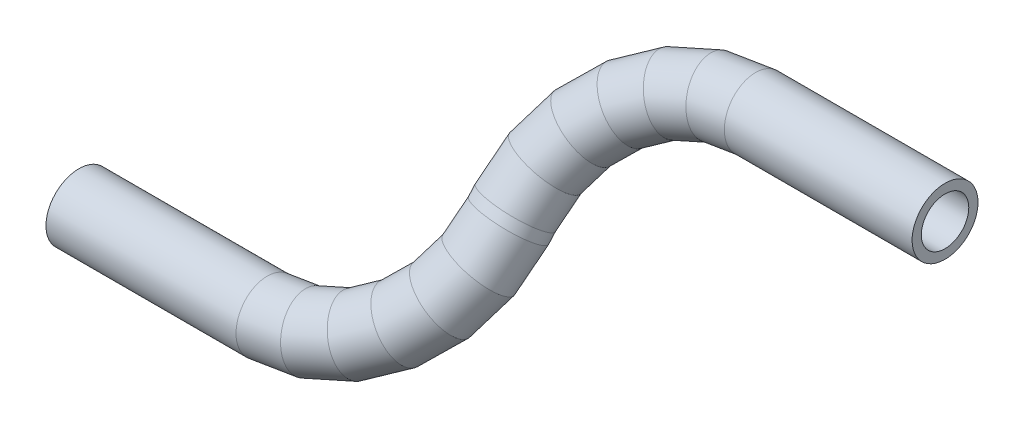
ISO-10303-21;
HEADER;
FILE_DESCRIPTION(('STEP AP214'),'2;1');
FILE_NAME('part.step','',(''),(''),'','','');
FILE_SCHEMA(('AUTOMOTIVE_DESIGN { 1 0 10303 214 1 1 1 1 }'));
ENDSEC;
DATA;
#1=APPLICATION_CONTEXT('core data for automotive mechanical design processes');
#2=APPLICATION_PROTOCOL_DEFINITION('international standard','automotive_design',2000,#1);
#3=PRODUCT_CONTEXT('',#1,'mechanical');
#4=PRODUCT('Part','Part','',(#3));
#5=PRODUCT_RELATED_PRODUCT_CATEGORY('part','',(#4));
#6=PRODUCT_DEFINITION_FORMATION('','',#4);
#7=PRODUCT_DEFINITION_CONTEXT('part definition',#1,'design');
#8=PRODUCT_DEFINITION('design','',#6,#7);
#9=PRODUCT_DEFINITION_SHAPE('','',#8);
#10=(LENGTH_UNIT() NAMED_UNIT(*) SI_UNIT(.MILLI.,.METRE.));
#11=(NAMED_UNIT(*) PLANE_ANGLE_UNIT() SI_UNIT($,.RADIAN.));
#12=(NAMED_UNIT(*) SI_UNIT($,.STERADIAN.) SOLID_ANGLE_UNIT());
#13=UNCERTAINTY_MEASURE_WITH_UNIT(LENGTH_MEASURE(1.E-05),#10,'distance_accuracy_value','');
#14=(GEOMETRIC_REPRESENTATION_CONTEXT(3) GLOBAL_UNCERTAINTY_ASSIGNED_CONTEXT((#13)) GLOBAL_UNIT_ASSIGNED_CONTEXT((#10,
#11,#12)) REPRESENTATION_CONTEXT('',''));
#15=CARTESIAN_POINT('',(0.,0.,0.));
#16=DIRECTION('',(0.,0.,1.));
#17=DIRECTION('',(1.,0.,0.));
#18=AXIS2_PLACEMENT_3D('',#15,#16,#17);
#19=CARTESIAN_POINT('',(-2128.60450482966,-50.159053651247,36.4426856421328));
#20=DIRECTION('',(-1.,0.,0.));
#21=DIRECTION('',(0.,0.,1.));
#22=AXIS2_PLACEMENT_3D('',#19,#20,#21);
#23=CYLINDRICAL_SURFACE('',#22,3.175);
#24=CARTESIAN_POINT('',(-2129.18796047896,-50.1590536512477,36.442685642133));
#25=DIRECTION('',(-0.99803668420921,-0.0506704140618011,0.0368142107275402));
#26=DIRECTION('',(0.0626320762284479,-0.807428638534867,0.586631244225063));
#27=AXIS2_PLACEMENT_3D('',#24,#25,#26);
#28=ELLIPSE('',#27,3.18124579009408,3.175);
#29=CARTESIAN_POINT('',(-2128.98871245013,-52.7276826083881,38.3089038181616));
#30=VERTEX_POINT('',#29);
#31=EDGE_CURVE('E45',#30,#30,#28,.T.);
#32=ORIENTED_EDGE('',*,*,#31,.T.);
#33=EDGE_LOOP('',(#32));
#34=FACE_BOUND('',#33,.T.);
#35=CARTESIAN_POINT('',(-2147.38796047896,-50.159053651247,36.4426856421328));
#36=DIRECTION('',(1.,0.,0.));
#37=DIRECTION('',(0.,0.,-1.));
#38=AXIS2_PLACEMENT_3D('',#35,#36,#37);
#39=CIRCLE('',#38,3.175);
#40=CARTESIAN_POINT('',(-2147.38796047896,-50.159053651247,33.2676856421328));
#41=VERTEX_POINT('',#40);
#42=EDGE_CURVE('E98',#41,#41,#39,.T.);
#43=ORIENTED_EDGE('',*,*,#42,.T.);
#44=EDGE_LOOP('',(#43));
#45=FACE_BOUND('',#44,.T.);
#46=ADVANCED_FACE('F39',(#34,#45),#23,.T.);
#47=CARTESIAN_POINT('',(-2124.40450524761,-49.6714203188121,36.0883992880456));
#48=DIRECTION('',(-0.992154446054628,-0.101141864075495,0.0734838656125867));
#49=DIRECTION('',(0.101416051901151,-0.994844100558868,0.));
#50=AXIS2_PLACEMENT_3D('',#47,#48,#49);
#51=CYLINDRICAL_SURFACE('',#50,3.175);
#52=CARTESIAN_POINT('',(-2125.46683901343,-49.7797163787383,36.1670809811975));
#53=DIRECTION('',(-0.96874088965193,-0.200696700249514,0.145814687961616));
#54=DIRECTION('',(0.248074764368299,-0.783727842874325,0.569411608230084));
#55=AXIS2_PLACEMENT_3D('',#52,#53,#54);
#56=ELLIPSE('',#55,3.20010660903211,3.175);
#57=CARTESIAN_POINT('',(-2124.67297332044,-52.2877290284029,37.9892588319542));
#58=VERTEX_POINT('',#57);
#59=EDGE_CURVE('E136',#58,#58,#56,.T.);
#60=ORIENTED_EDGE('',*,*,#59,.T.);
#61=EDGE_LOOP('',(#60));
#62=FACE_BOUND('',#61,.T.);
#63=ORIENTED_EDGE('',*,*,#31,.F.);
#64=EDGE_LOOP('',(#63));
#65=FACE_BOUND('',#64,.T.);
#66=ADVANCED_FACE('F144',(#62,#65),#51,.T.);
#67=CARTESIAN_POINT('',(-2120.98243689193,-48.3473023497276,35.1263712714097));
#68=DIRECTION('',(-0.930126715431528,-0.297102382846602,0.215857516309784));
#69=DIRECTION('',(0.30427572162067,-0.952584004291601,0.));
#70=AXIS2_PLACEMENT_3D('',#67,#68,#69);
#71=CYLINDRICAL_SURFACE('',#70,3.175);
#72=CARTESIAN_POINT('',(-2121.97835544093,-48.6654200525308,35.3574973114077));
#73=DIRECTION('',(-0.876917822567226,-0.388846199899843,0.28251330108051));
#74=DIRECTION('',(0.480640335868678,-0.709441421127152,0.515439363577454));
#75=AXIS2_PLACEMENT_3D('',#72,#73,#74);
#76=ELLIPSE('',#75,3.2001066090321,3.175);
#77=CARTESIAN_POINT('',(-2120.44025512555,-50.9357082330009,37.0069582253472));
#78=VERTEX_POINT('',#77);
#79=EDGE_CURVE('E131',#78,#78,#76,.T.);
#80=ORIENTED_EDGE('',*,*,#79,.T.);
#81=EDGE_LOOP('',(#80));
#82=FACE_BOUND('',#81,.T.);
#83=ORIENTED_EDGE('',*,*,#59,.F.);
#84=EDGE_LOOP('',(#83));
#85=FACE_BOUND('',#84,.T.);
#86=ADVANCED_FACE('F150',(#82,#85),#71,.T.);
#87=CARTESIAN_POINT('',(-2118.07336327079,-46.3777773033388,33.6954275652366));
#88=DIRECTION('',(-0.809949117537705,-0.47448858927755,0.34473613916341));
#89=DIRECTION('',(0.50547435450549,-0.862841629116988,0.));
#90=AXIS2_PLACEMENT_3D('',#87,#88,#89);
#91=CYLINDRICAL_SURFACE('',#90,3.175);
#92=CARTESIAN_POINT('',(-2118.94060354732,-46.8858284962679,34.0645483633039));
#93=DIRECTION('',(-0.730271413518866,-0.552685727007994,0.401549685292869));
#94=DIRECTION('',(0.683157128775773,-0.590801984042985,0.429242767037158));
#95=AXIS2_PLACEMENT_3D('',#92,#93,#94);
#96=ELLIPSE('',#95,3.20010660903212,3.175);
#97=CARTESIAN_POINT('',(-2116.75442790452,-48.7764578300331,35.4381709789788));
#98=VERTEX_POINT('',#97);
#99=EDGE_CURVE('E132',#98,#98,#96,.T.);
#100=ORIENTED_EDGE('',*,*,#99,.T.);
#101=EDGE_LOOP('',(#100));
#102=FACE_BOUND('',#101,.T.);
#103=ORIENTED_EDGE('',*,*,#79,.F.);
#104=EDGE_LOOP('',(#103));
#105=FACE_BOUND('',#104,.T.);
#106=ADVANCED_FACE('F155',(#102,#105),#91,.T.);
#107=CARTESIAN_POINT('',(-2115.85915449086,-43.8859763811632,31.8850282239536));
#108=DIRECTION('',(-0.639134941960971,-0.622210613366278,0.4520624719869));
#109=DIRECTION('',(0.697556260910853,-0.716530015326692,0.));
#110=AXIS2_PLACEMENT_3D('',#107,#108,#109);
#111=CYLINDRICAL_SURFACE('',#110,3.175);
#112=CARTESIAN_POINT('',(-2116.54349817592,-44.5521986076137,32.3690670045722));
#113=DIRECTION('',(-0.537969735072089,-0.681972325859421,0.495481897659599));
#114=DIRECTION('',(0.842964153535882,-0.435226658132701,0.316210676455073));
#115=AXIS2_PLACEMENT_3D('',#112,#113,#114);
#116=ELLIPSE('',#115,3.20010660903208,3.175);
#117=CARTESIAN_POINT('',(-2113.84592301701,-45.9449703127311,33.3809748801426));
#118=VERTEX_POINT('',#117);
#119=EDGE_CURVE('E126',#118,#118,#116,.T.);
#120=ORIENTED_EDGE('',*,*,#119,.T.);
#121=EDGE_LOOP('',(#120));
#122=FACE_BOUND('',#121,.T.);
#123=ORIENTED_EDGE('',*,*,#99,.F.);
#124=EDGE_LOOP('',(#123));
#125=FACE_BOUND('',#124,.T.);
#126=ADVANCED_FACE('F266',(#122,#125),#111,.T.);
#127=CARTESIAN_POINT('',(-2114.47823894531,-41.0276825431835,29.8083561931255));
#128=DIRECTION('',(-0.428363187028244,-0.731033137009012,0.531126663418218));
#129=DIRECTION('',(0.,-0.587785252292474,-0.809016994374947));
#130=AXIS2_PLACEMENT_3D('',#127,#128,#129);
#131=CYLINDRICAL_SURFACE('',#130,3.175);
#132=CARTESIAN_POINT('',(-2114.93690208936,-41.8104247749694,30.3770517129843));
#133=DIRECTION('',(-0.312035146000277,-0.768623228334108,0.558437463397505));
#134=DIRECTION('',(0.9500705593063,-0.252441735956495,0.183409657015889));
#135=AXIS2_PLACEMENT_3D('',#132,#133,#134);
#136=ELLIPSE('',#135,3.2001066090321,3.175);
#137=CARTESIAN_POINT('',(-2111.89657501348,-42.6182652425993,30.9639821685612));
#138=VERTEX_POINT('',#137);
#139=EDGE_CURVE('E124',#138,#138,#136,.T.);
#140=ORIENTED_EDGE('',*,*,#139,.T.);
#141=EDGE_LOOP('',(#140));
#142=FACE_BOUND('',#141,.T.);
#143=ORIENTED_EDGE('',*,*,#119,.F.);
#144=EDGE_LOOP('',(#143));
#145=FACE_BOUND('',#144,.T.);
#146=ADVANCED_FACE('F265',(#142,#145),#131,.T.);
#147=CARTESIAN_POINT('',(-2114.10992710257,-38.3685649000429,27.876394138415));
#148=DIRECTION('',(-0.190810927830717,-0.794152769656083,0.57698576088839));
#149=DIRECTION('',(0.,-0.587785252292473,-0.809016994374947));
#150=AXIS2_PLACEMENT_3D('',#147,#148,#149);
#151=CYLINDRICAL_SURFACE('',#150,3.175);
#152=CARTESIAN_POINT('',(-2114.22125681636,-38.8319178199039,28.2130397401692));
#153=DIRECTION('',(-0.128954980668213,-0.802262065703807,0.582877509339245));
#154=DIRECTION('',(0.991650448979307,-0.104326770869898,0.075797835846408));
#155=AXIS2_PLACEMENT_3D('',#152,#153,#154);
#156=ELLIPSE('',#155,3.18124579009406,3.175);
#157=CARTESIAN_POINT('',(-2111.0665730003,-39.1638069205279,28.4541712863538));
#158=VERTEX_POINT('',#157);
#159=EDGE_CURVE('E125',#158,#158,#156,.T.);
#160=ORIENTED_EDGE('',*,*,#159,.T.);
#161=EDGE_LOOP('',(#160));
#162=FACE_BOUND('',#161,.T.);
#163=ORIENTED_EDGE('',*,*,#139,.F.);
#164=EDGE_LOOP('',(#163));
#165=FACE_BOUND('',#164,.T.);
#166=ADVANCED_FACE('F256',(#162,#165),#151,.T.);
#167=CARTESIAN_POINT('',(-2114.11581026924,-37.5537188914046,27.2843738593636));
#168=DIRECTION('',(-0.066592674806016,-0.807221174187645,0.586480512553742));
#169=DIRECTION('',(0.,-0.58778525229247,-0.80901699437495));
#170=AXIS2_PLACEMENT_3D('',#167,#168,#169);
#171=CYLINDRICAL_SURFACE('',#170,3.175);
#172=CARTESIAN_POINT('',(-2114.15466414156,-38.0246966457161,27.6265592276155));
#173=DIRECTION('',(-0.128954980668155,-0.802262065703813,0.582877509339249));
#174=DIRECTION('',(-0.991650448979315,0.104326770869849,-0.0757978358463761));
#175=AXIS2_PLACEMENT_3D('',#172,#173,#174);
#176=ELLIPSE('',#175,3.18124579009405,3.175);
#177=CARTESIAN_POINT('',(-2117.30934795762,-37.6928075450923,27.385427681431));
#178=VERTEX_POINT('',#177);
#179=EDGE_CURVE('E116',#178,#178,#176,.T.);
#180=ORIENTED_EDGE('',*,*,#179,.T.);
#181=EDGE_LOOP('',(#180));
#182=FACE_BOUND('',#181,.T.);
#183=ORIENTED_EDGE('',*,*,#159,.F.);
#184=EDGE_LOOP('',(#183));
#185=FACE_BOUND('',#184,.T.);
#186=ADVANCED_FACE('F255',(#182,#185),#171,.T.);
#187=CARTESIAN_POINT('',(-2113.23471106917,-34.1958631051234,24.8447488277215));
#188=DIRECTION('',(-0.190810927830602,-0.794152769656101,0.576985760888402));
#189=DIRECTION('',(0.,-0.587785252292473,-0.809016994374947));
#190=AXIS2_PLACEMENT_3D('',#187,#188,#189);
#191=CYLINDRICAL_SURFACE('',#190,3.175);
#192=CARTESIAN_POINT('',(-2113.43901886855,-35.0461896906503,25.4625472548011));
#193=DIRECTION('',(-0.312035146000222,-0.768623228334123,0.558437463397515));
#194=DIRECTION('',(-0.950070559306318,0.252441735956447,-0.183409657015859));
#195=AXIS2_PLACEMENT_3D('',#192,#193,#194);
#196=ELLIPSE('',#195,3.20010660903212,3.175);
#197=CARTESIAN_POINT('',(-2116.47934594444,-34.2383492230205,24.8756167992243));
#198=VERTEX_POINT('',#197);
#199=EDGE_CURVE('E117',#198,#198,#196,.T.);
#200=ORIENTED_EDGE('',*,*,#199,.T.);
#201=EDGE_LOOP('',(#200));
#202=FACE_BOUND('',#201,.T.);
#203=ORIENTED_EDGE('',*,*,#179,.F.);
#204=EDGE_LOOP('',(#203));
#205=FACE_BOUND('',#204,.T.);
#206=ADVANCED_FACE('F249',(#202,#205),#191,.T.);
#207=CARTESIAN_POINT('',(-2111.37375963794,-31.52167362622,22.9018364433544));
#208=DIRECTION('',(-0.428363187028243,-0.731033137009013,0.531126663418218));
#209=DIRECTION('',(0.,-0.587785252292473,-0.809016994374947));
#210=AXIS2_PLACEMENT_3D('',#207,#208,#209);
#211=CYLINDRICAL_SURFACE('',#210,3.175);
#212=CARTESIAN_POINT('',(-2111.832422782,-32.3044158580064,23.4705319632128));
#213=DIRECTION('',(-0.537969735072089,-0.681972325859421,0.4954818976596));
#214=DIRECTION('',(-0.842964153535882,0.435226658132709,-0.316210676455062));
#215=AXIS2_PLACEMENT_3D('',#212,#213,#214);
#216=ELLIPSE('',#215,3.20010660903208,3.175);
#217=CARTESIAN_POINT('',(-2114.5299979409,-30.9116441528889,22.4586240876424));
#218=VERTEX_POINT('',#217);
#219=EDGE_CURVE('E114',#218,#218,#216,.T.);
#220=ORIENTED_EDGE('',*,*,#219,.T.);
#221=EDGE_LOOP('',(#220));
#222=FACE_BOUND('',#221,.T.);
#223=ORIENTED_EDGE('',*,*,#199,.F.);
#224=EDGE_LOOP('',(#223));
#225=FACE_BOUND('',#224,.T.);
#226=ADVANCED_FACE('F246',(#222,#225),#211,.T.);
#227=CARTESIAN_POINT('',(-2108.75097372553,-29.3045637429012,21.2910118238621));
#228=DIRECTION('',(-0.639134941960971,-0.622210613366276,0.452062471986901));
#229=DIRECTION('',(0.697556260910852,-0.716530015326694,0.));
#230=AXIS2_PLACEMENT_3D('',#227,#228,#229);
#231=CYLINDRICAL_SURFACE('',#230,3.175);
#232=CARTESIAN_POINT('',(-2109.43531741059,-29.9707859693524,21.7750506044811));
#233=DIRECTION('',(-0.73027141351889,-0.552685727007973,0.401549685292854));
#234=DIRECTION('',(-0.683157128775747,0.590801984042994,-0.429242767037186));
#235=AXIS2_PLACEMENT_3D('',#232,#233,#234);
#236=ELLIPSE('',#235,3.20010660903213,3.175);
#237=CARTESIAN_POINT('',(-2111.6214930534,-28.0801566355871,20.4014279888062));
#238=VERTEX_POINT('',#237);
#239=EDGE_CURVE('E109',#238,#238,#236,.T.);
#240=ORIENTED_EDGE('',*,*,#239,.T.);
#241=EDGE_LOOP('',(#240));
#242=FACE_BOUND('',#241,.T.);
#243=ORIENTED_EDGE('',*,*,#219,.F.);
#244=EDGE_LOOP('',(#243));
#245=FACE_BOUND('',#244,.T.);
#246=ADVANCED_FACE('F245',(#242,#245),#231,.T.);
#247=CARTESIAN_POINT('',(-2105.53032524046,-27.6831432201609,20.1129808583104));
#248=DIRECTION('',(-0.809949117537746,-0.474488589277505,0.344736139163375));
#249=DIRECTION('',(0.505474354505436,-0.86284162911702,0.));
#250=AXIS2_PLACEMENT_3D('',#247,#248,#249);
#251=CYLINDRICAL_SURFACE('',#250,3.175);
#252=CARTESIAN_POINT('',(-2106.39756551699,-28.1911944130899,20.482101656377));
#253=DIRECTION('',(-0.876917822567243,-0.388846199899818,0.282513301080492));
#254=DIRECTION('',(-0.480640335868647,0.709441421127176,-0.51543936357745));
#255=AXIS2_PLACEMENT_3D('',#252,#253,#254);
#256=ELLIPSE('',#255,3.20010660903209,3.175);
#257=CARTESIAN_POINT('',(-2107.93566583237,-25.9209062326197,18.8326407424376));
#258=VERTEX_POINT('',#257);
#259=EDGE_CURVE('E110',#258,#258,#256,.T.);
#260=ORIENTED_EDGE('',*,*,#259,.T.);
#261=EDGE_LOOP('',(#260));
#262=FACE_BOUND('',#261,.T.);
#263=ORIENTED_EDGE('',*,*,#239,.F.);
#264=EDGE_LOOP('',(#263));
#265=FACE_BOUND('',#264,.T.);
#266=ADVANCED_FACE('F236',(#262,#265),#251,.T.);
#267=CARTESIAN_POINT('',(-2101.91316339548,-26.7587803840793,19.4413919465893));
#268=DIRECTION('',(-0.930126715431528,-0.297102382846601,0.215857516309786));
#269=DIRECTION('',(0.30427572162067,-0.952584004291601,0.));
#270=AXIS2_PLACEMENT_3D('',#267,#268,#269);
#271=CYLINDRICAL_SURFACE('',#270,3.175);
#272=CARTESIAN_POINT('',(-2102.90908194448,-27.0768980868827,19.6725179865873));
#273=DIRECTION('',(-0.96874088965193,-0.200696700249514,0.145814687961616));
#274=DIRECTION('',(-0.248074764368298,0.783727842874317,-0.569411608230096));
#275=AXIS2_PLACEMENT_3D('',#272,#273,#274);
#276=ELLIPSE('',#275,3.20010660903211,3.175);
#277=CARTESIAN_POINT('',(-2103.70294763747,-24.5688854372181,17.8503401358306));
#278=VERTEX_POINT('',#277);
#279=EDGE_CURVE('E102',#278,#278,#276,.T.);
#280=ORIENTED_EDGE('',*,*,#279,.T.);
#281=EDGE_LOOP('',(#280));
#282=FACE_BOUND('',#281,.T.);
#283=ORIENTED_EDGE('',*,*,#259,.F.);
#284=EDGE_LOOP('',(#283));
#285=FACE_BOUND('',#284,.T.);
#286=ADVANCED_FACE('F233',(#282,#285),#271,.T.);
#287=CARTESIAN_POINT('',(-2098.60908236243,-26.6385490223978,19.3540387491277));
#288=DIRECTION('',(-0.992154446054628,-0.101141864075495,0.0734838656125849));
#289=DIRECTION('',(0.101416051901151,-0.994844100558868,0.));
#290=AXIS2_PLACEMENT_3D('',#287,#288,#289);
#291=CYLINDRICAL_SURFACE('',#290,3.175);
#292=CARTESIAN_POINT('',(-2099.18796047896,-26.6975608143733,19.3969133256516));
#293=DIRECTION('',(-0.99803668420921,-0.0506704140618011,0.0368142107275393));
#294=DIRECTION('',(-0.0626320762284474,0.807428638534874,-0.586631244225053));
#295=AXIS2_PLACEMENT_3D('',#292,#293,#294);
#296=ELLIPSE('',#295,3.18124579009408,3.175);
#297=CARTESIAN_POINT('',(-2099.38720850779,-24.1289318572328,17.530695149623));
#298=VERTEX_POINT('',#297);
#299=EDGE_CURVE('E101',#298,#298,#296,.T.);
#300=ORIENTED_EDGE('',*,*,#299,.T.);
#301=EDGE_LOOP('',(#300));
#302=FACE_BOUND('',#301,.T.);
#303=ORIENTED_EDGE('',*,*,#279,.F.);
#304=EDGE_LOOP('',(#303));
#305=FACE_BOUND('',#304,.T.);
#306=ADVANCED_FACE('F228',(#302,#305),#291,.T.);
#307=CARTESIAN_POINT('',(-2080.98796047896,-26.6975608143733,19.3969133256516));
#308=DIRECTION('',(-1.,0.,0.));
#309=DIRECTION('',(0.,0.,1.));
#310=AXIS2_PLACEMENT_3D('',#307,#308,#309);
#311=CYLINDRICAL_SURFACE('',#310,3.175);
#312=CARTESIAN_POINT('',(-2080.98796047896,-26.6975608143733,19.3969133256516));
#313=DIRECTION('',(1.,0.,0.));
#314=DIRECTION('',(0.,0.,-1.));
#315=AXIS2_PLACEMENT_3D('',#312,#313,#314);
#316=CIRCLE('',#315,3.175);
#317=CARTESIAN_POINT('',(-2080.98796047896,-26.6975608143733,16.2219133256516));
#318=VERTEX_POINT('',#317);
#319=EDGE_CURVE('E92',#318,#318,#316,.T.);
#320=ORIENTED_EDGE('',*,*,#319,.F.);
#321=EDGE_LOOP('',(#320));
#322=FACE_BOUND('',#321,.T.);
#323=ORIENTED_EDGE('',*,*,#299,.F.);
#324=EDGE_LOOP('',(#323));
#325=FACE_BOUND('',#324,.T.);
#326=ADVANCED_FACE('F227',(#322,#325),#311,.T.);
#327=CARTESIAN_POINT('',(-2147.38796047896,-50.159053651247,36.4426856421328));
#328=DIRECTION('',(1.,0.,0.));
#329=DIRECTION('',(0.,0.,-1.));
#330=AXIS2_PLACEMENT_3D('',#327,#328,#329);
#331=PLANE('',#330);
#332=CARTESIAN_POINT('',(-2147.38796047896,-50.159053651247,36.4426856421328));
#333=DIRECTION('',(1.,0.,0.));
#334=DIRECTION('',(0.,0.,-1.));
#335=AXIS2_PLACEMENT_3D('',#332,#333,#334);
#336=CIRCLE('',#335,2.286);
#337=CARTESIAN_POINT('',(-2147.38796047896,-50.159053651247,34.1566856421328));
#338=VERTEX_POINT('',#337);
#339=EDGE_CURVE('E95',#338,#338,#336,.F.);
#340=ORIENTED_EDGE('',*,*,#339,.F.);
#341=EDGE_LOOP('',(#340));
#342=FACE_BOUND('',#341,.T.);
#343=ORIENTED_EDGE('',*,*,#42,.F.);
#344=EDGE_LOOP('',(#343));
#345=FACE_BOUND('',#344,.T.);
#346=ADVANCED_FACE('F225',(#342,#345),#331,.F.);
#347=CARTESIAN_POINT('',(-2080.98796047896,-26.6975608143733,19.3969133256516));
#348=DIRECTION('',(1.,0.,0.));
#349=DIRECTION('',(0.,0.,-1.));
#350=AXIS2_PLACEMENT_3D('',#347,#348,#349);
#351=PLANE('',#350);
#352=CARTESIAN_POINT('',(-2080.98796047896,-26.6975608143733,19.3969133256516));
#353=DIRECTION('',(1.,0.,0.));
#354=DIRECTION('',(0.,0.,-1.));
#355=AXIS2_PLACEMENT_3D('',#352,#353,#354);
#356=CIRCLE('',#355,2.286);
#357=CARTESIAN_POINT('',(-2080.98796047896,-26.6975608143733,17.1109133256516));
#358=VERTEX_POINT('',#357);
#359=EDGE_CURVE('E46',#358,#358,#356,.F.);
#360=ORIENTED_EDGE('',*,*,#359,.T.);
#361=EDGE_LOOP('',(#360));
#362=FACE_BOUND('',#361,.T.);
#363=ORIENTED_EDGE('',*,*,#319,.T.);
#364=EDGE_LOOP('',(#363));
#365=FACE_BOUND('',#364,.T.);
#366=ADVANCED_FACE('F217',(#362,#365),#351,.T.);
#367=CARTESIAN_POINT('',(-2128.73987241146,-50.159053651247,36.4426856421328));
#368=DIRECTION('',(-1.,0.,0.));
#369=DIRECTION('',(0.,0.,1.));
#370=AXIS2_PLACEMENT_3D('',#367,#368,#369);
#371=CYLINDRICAL_SURFACE('',#370,2.286);
#372=CARTESIAN_POINT('',(-2129.18796047896,-50.1590536512477,36.442685642133));
#373=DIRECTION('',(-0.99803668420921,-0.0506704140618011,0.0368142107275402));
#374=DIRECTION('',(0.0626320762284479,-0.807428638534867,0.586631244225063));
#375=AXIS2_PLACEMENT_3D('',#372,#373,#374);
#376=ELLIPSE('',#375,2.29049696886774,2.286);
#377=CARTESIAN_POINT('',(-2129.0445018982,-52.0084665003888,37.7863627288736));
#378=VERTEX_POINT('',#377);
#379=EDGE_CURVE('E90',#378,#378,#376,.F.);
#380=ORIENTED_EDGE('',*,*,#379,.T.);
#381=EDGE_LOOP('',(#380));
#382=FACE_BOUND('',#381,.T.);
#383=ORIENTED_EDGE('',*,*,#339,.T.);
#384=EDGE_LOOP('',(#383));
#385=FACE_BOUND('',#384,.T.);
#386=ADVANCED_FACE('F212',(#382,#385),#371,.F.);
#387=CARTESIAN_POINT('',(-2124.67417837755,-49.6989112433973,36.1083726138909));
#388=DIRECTION('',(-0.992154446054628,-0.101141864075495,0.0734838656125867));
#389=DIRECTION('',(0.101416051901151,-0.994844100558868,0.));
#390=AXIS2_PLACEMENT_3D('',#387,#388,#389);
#391=CYLINDRICAL_SURFACE('',#390,2.286);
#392=CARTESIAN_POINT('',(-2125.46683901343,-49.7797163787382,36.1670809811974));
#393=DIRECTION('',(-0.96874088965193,-0.200696700249514,0.145814687961616));
#394=DIRECTION('',(0.248074764368299,-0.783727842874325,0.569411608230085));
#395=AXIS2_PLACEMENT_3D('',#392,#393,#394);
#396=ELLIPSE('',#395,2.30407675850312,2.286);
#397=CARTESIAN_POINT('',(-2124.89525571448,-51.5854854864967,37.4790490337422));
#398=VERTEX_POINT('',#397);
#399=EDGE_CURVE('E88',#398,#398,#396,.F.);
#400=ORIENTED_EDGE('',*,*,#399,.T.);
#401=EDGE_LOOP('',(#400));
#402=FACE_BOUND('',#401,.T.);
#403=ORIENTED_EDGE('',*,*,#379,.F.);
#404=EDGE_LOOP('',(#403));
#405=FACE_BOUND('',#404,.T.);
#406=ADVANCED_FACE('F209',(#402,#405),#391,.F.);
#407=CARTESIAN_POINT('',(-2121.23525053762,-48.4280564397929,35.1850425521525));
#408=DIRECTION('',(-0.930126715431528,-0.297102382846602,0.215857516309784));
#409=DIRECTION('',(0.30427572162067,-0.952584004291601,0.));
#410=AXIS2_PLACEMENT_3D('',#407,#408,#409);
#411=CYLINDRICAL_SURFACE('',#410,2.286);
#412=CARTESIAN_POINT('',(-2121.97835544093,-48.6654200525307,35.3574973114076));
#413=DIRECTION('',(-0.876917822567226,-0.388846199899843,0.28251330108051));
#414=DIRECTION('',(0.480640335868678,-0.709441421127153,0.515439363577454));
#415=AXIS2_PLACEMENT_3D('',#412,#413,#414);
#416=ELLIPSE('',#415,2.30407675850311,2.286);
#417=CARTESIAN_POINT('',(-2120.87092321385,-50.3000275424692,36.5451091694441));
#418=VERTEX_POINT('',#417);
#419=EDGE_CURVE('E82',#418,#418,#416,.F.);
#420=ORIENTED_EDGE('',*,*,#419,.T.);
#421=EDGE_LOOP('',(#420));
#422=FACE_BOUND('',#421,.T.);
#423=ORIENTED_EDGE('',*,*,#399,.F.);
#424=EDGE_LOOP('',(#423));
#425=FACE_BOUND('',#424,.T.);
#426=ADVANCED_FACE('F206',(#422,#425),#411,.F.);
#427=CARTESIAN_POINT('',(-2118.29351197293,-46.5067459568593,33.7891287767988));
#428=DIRECTION('',(-0.809949117537705,-0.47448858927755,0.34473613916341));
#429=DIRECTION('',(0.50547435450549,-0.862841629116988,0.));
#430=AXIS2_PLACEMENT_3D('',#427,#428,#429);
#431=CYLINDRICAL_SURFACE('',#430,2.286);
#432=CARTESIAN_POINT('',(-2118.94060354732,-46.8858284962679,34.0645483633039));
#433=DIRECTION('',(-0.730271413518866,-0.552685727007995,0.401549685292869));
#434=DIRECTION('',(0.683157128775773,-0.590801984042984,0.429242767037158));
#435=AXIS2_PLACEMENT_3D('',#432,#433,#434);
#436=ELLIPSE('',#435,2.30407675850312,2.286);
#437=CARTESIAN_POINT('',(-2117.3665570845,-48.2470816165789,35.0535566465898));
#438=VERTEX_POINT('',#437);
#439=EDGE_CURVE('E78',#438,#438,#436,.F.);
#440=ORIENTED_EDGE('',*,*,#439,.T.);
#441=EDGE_LOOP('',(#440));
#442=FACE_BOUND('',#441,.T.);
#443=ORIENTED_EDGE('',*,*,#419,.F.);
#444=EDGE_LOOP('',(#443));
#445=FACE_BOUND('',#444,.T.);
#446=ADVANCED_FACE('F205',(#442,#445),#431,.F.);
#447=CARTESIAN_POINT('',(-2116.0328749443,-44.0550967073952,32.0079013333112));
#448=DIRECTION('',(-0.639134941960971,-0.622210613366278,0.4520624719869));
#449=DIRECTION('',(0.697556260910853,-0.716530015326692,0.));
#450=AXIS2_PLACEMENT_3D('',#447,#448,#449);
#451=CYLINDRICAL_SURFACE('',#450,2.286);
#452=CARTESIAN_POINT('',(-2116.54349817592,-44.5521986076138,32.3690670045722));
#453=DIRECTION('',(-0.537969735072089,-0.681972325859421,0.495481897659599));
#454=DIRECTION('',(0.842964153535882,-0.435226658132701,0.316210676455073));
#455=AXIS2_PLACEMENT_3D('',#452,#453,#454);
#456=ELLIPSE('',#455,2.3040767585031,2.286);
#457=CARTESIAN_POINT('',(-2114.60124406151,-45.5549942352984,33.0976406749828));
#458=VERTEX_POINT('',#457);
#459=EDGE_CURVE('E80',#458,#458,#456,.F.);
#460=ORIENTED_EDGE('',*,*,#459,.T.);
#461=EDGE_LOOP('',(#460));
#462=FACE_BOUND('',#461,.T.);
#463=ORIENTED_EDGE('',*,*,#439,.F.);
#464=EDGE_LOOP('',(#463));
#465=FACE_BOUND('',#464,.T.);
#466=ADVANCED_FACE('F196',(#462,#465),#451,.F.);
#467=CARTESIAN_POINT('',(-2114.59467045641,-41.2263814402474,29.9527193921101));
#468=DIRECTION('',(-0.428363187028244,-0.731033137009012,0.531126663418218));
#469=DIRECTION('',(0.,-0.587785252292474,-0.809016994374947));
#470=AXIS2_PLACEMENT_3D('',#467,#468,#469);
#471=CYLINDRICAL_SURFACE('',#470,2.286);
#472=CARTESIAN_POINT('',(-2114.93690208936,-41.8104247749695,30.3770517129843));
#473=DIRECTION('',(-0.312035146000277,-0.768623228334107,0.558437463397505));
#474=DIRECTION('',(0.9500705593063,-0.252441735956495,0.183409657015888));
#475=AXIS2_PLACEMENT_3D('',#472,#473,#474);
#476=ELLIPSE('',#475,2.30407675850311,2.286);
#477=CARTESIAN_POINT('',(-2112.74786659473,-42.392069911663,30.7996416409996));
#478=VERTEX_POINT('',#477);
#479=EDGE_CURVE('E74',#478,#478,#476,.F.);
#480=ORIENTED_EDGE('',*,*,#479,.T.);
#481=EDGE_LOOP('',(#480));
#482=FACE_BOUND('',#481,.T.);
#483=ORIENTED_EDGE('',*,*,#459,.F.);
#484=EDGE_LOOP('',(#483));
#485=FACE_BOUND('',#484,.T.);
#486=ADVANCED_FACE('F193',(#482,#485),#471,.F.);
#487=CARTESIAN_POINT('',(-2114.13575671645,-38.4760674400537,27.9544993056013));
#488=DIRECTION('',(-0.190810927830717,-0.794152769656083,0.57698576088839));
#489=DIRECTION('',(0.,-0.587785252292473,-0.809016994374947));
#490=AXIS2_PLACEMENT_3D('',#487,#488,#489);
#491=CYLINDRICAL_SURFACE('',#490,2.286);
#492=CARTESIAN_POINT('',(-2114.22125681636,-38.8319178199039,28.2130397401692));
#493=DIRECTION('',(-0.128954980668213,-0.802262065703807,0.582877509339245));
#494=DIRECTION('',(0.991650448979307,-0.104326770869899,0.0757978358464065));
#495=AXIS2_PLACEMENT_3D('',#492,#493,#494);
#496=ELLIPSE('',#495,2.29049696886772,2.286);
#497=CARTESIAN_POINT('',(-2111.9498844688,-39.0708779723532,28.3866544534222));
#498=VERTEX_POINT('',#497);
#499=EDGE_CURVE('E72',#498,#498,#496,.F.);
#500=ORIENTED_EDGE('',*,*,#499,.T.);
#501=EDGE_LOOP('',(#500));
#502=FACE_BOUND('',#501,.T.);
#503=ORIENTED_EDGE('',*,*,#479,.F.);
#504=EDGE_LOOP('',(#503));
#505=FACE_BOUND('',#504,.T.);
#506=ADVANCED_FACE('F188',(#502,#505),#491,.F.);
#507=CARTESIAN_POINT('',(-2114.12482475859,-37.6629904697345,27.3637643081226));
#508=DIRECTION('',(-0.0665926748060161,-0.807221174187645,0.586480512553742));
#509=DIRECTION('',(0.,-0.58778525229247,-0.80901699437495));
#510=AXIS2_PLACEMENT_3D('',#507,#508,#509);
#511=CYLINDRICAL_SURFACE('',#510,2.286);
#512=CARTESIAN_POINT('',(-2114.15466414156,-38.0246966457161,27.6265592276155));
#513=DIRECTION('',(-0.128954980668155,-0.802262065703813,0.582877509339249));
#514=DIRECTION('',(-0.991650448979315,0.10432677086985,-0.0757978358463747));
#515=AXIS2_PLACEMENT_3D('',#512,#513,#514);
#516=ELLIPSE('',#515,2.29049696886771,2.286);
#517=CARTESIAN_POINT('',(-2116.42603648912,-37.785736493267,27.4529445143626));
#518=VERTEX_POINT('',#517);
#519=EDGE_CURVE('E67',#518,#518,#516,.F.);
#520=ORIENTED_EDGE('',*,*,#519,.T.);
#521=EDGE_LOOP('',(#520));
#522=FACE_BOUND('',#521,.T.);
#523=ORIENTED_EDGE('',*,*,#499,.F.);
#524=EDGE_LOOP('',(#523));
#525=FACE_BOUND('',#524,.T.);
#526=ADVANCED_FACE('F187',(#522,#525),#511,.F.);
#527=CARTESIAN_POINT('',(-2113.28657454702,-34.4117182715207,25.0015767859988));
#528=DIRECTION('',(-0.190810927830602,-0.794152769656101,0.576985760888402));
#529=DIRECTION('',(0.,-0.587785252292473,-0.809016994374947));
#530=AXIS2_PLACEMENT_3D('',#527,#528,#529);
#531=CYLINDRICAL_SURFACE('',#530,2.286);
#532=CARTESIAN_POINT('',(-2113.43901886855,-35.0461896906503,25.4625472548009));
#533=DIRECTION('',(-0.312035146000222,-0.768623228334123,0.558437463397515));
#534=DIRECTION('',(-0.950070559306318,0.252441735956448,-0.183409657015858));
#535=AXIS2_PLACEMENT_3D('',#532,#533,#534);
#536=ELLIPSE('',#535,2.30407675850313,2.286);
#537=CARTESIAN_POINT('',(-2115.62805436319,-34.4645445539568,25.0399573267857));
#538=VERTEX_POINT('',#537);
#539=EDGE_CURVE('E63',#538,#538,#536,.F.);
#540=ORIENTED_EDGE('',*,*,#539,.T.);
#541=EDGE_LOOP('',(#540));
#542=FACE_BOUND('',#541,.T.);
#543=ORIENTED_EDGE('',*,*,#519,.F.);
#544=EDGE_LOOP('',(#543));
#545=FACE_BOUND('',#544,.T.);
#546=ADVANCED_FACE('F185',(#542,#545),#531,.F.);
#547=CARTESIAN_POINT('',(-2111.49019114904,-31.720372523284,23.046199642339));
#548=DIRECTION('',(-0.428363187028243,-0.731033137009012,0.531126663418218));
#549=DIRECTION('',(0.,-0.587785252292473,-0.809016994374947));
#550=AXIS2_PLACEMENT_3D('',#547,#548,#549);
#551=CYLINDRICAL_SURFACE('',#550,2.286);
#552=CARTESIAN_POINT('',(-2111.832422782,-32.3044158580065,23.4705319632129));
#553=DIRECTION('',(-0.537969735072089,-0.681972325859421,0.4954818976596));
#554=DIRECTION('',(-0.842964153535882,0.435226658132709,-0.316210676455062));
#555=AXIS2_PLACEMENT_3D('',#552,#553,#554);
#556=ELLIPSE('',#555,2.3040767585031,2.286);
#557=CARTESIAN_POINT('',(-2113.77467689641,-31.3016202303219,22.7419582928022));
#558=VERTEX_POINT('',#557);
#559=EDGE_CURVE('E65',#558,#558,#556,.F.);
#560=ORIENTED_EDGE('',*,*,#559,.T.);
#561=EDGE_LOOP('',(#560));
#562=FACE_BOUND('',#561,.T.);
#563=ORIENTED_EDGE('',*,*,#539,.F.);
#564=EDGE_LOOP('',(#563));
#565=FACE_BOUND('',#564,.T.);
#566=ADVANCED_FACE('F177',(#562,#565),#551,.F.);
#567=CARTESIAN_POINT('',(-2108.92469417897,-29.4736840691332,21.4138849332197));
#568=DIRECTION('',(-0.639134941960971,-0.622210613366276,0.452062471986901));
#569=DIRECTION('',(0.697556260910852,-0.716530015326694,0.));
#570=AXIS2_PLACEMENT_3D('',#567,#568,#569);
#571=CYLINDRICAL_SURFACE('',#570,2.286);
#572=CARTESIAN_POINT('',(-2109.43531741059,-29.9707859693522,21.7750506044811));
#573=DIRECTION('',(-0.73027141351889,-0.552685727007973,0.401549685292854));
#574=DIRECTION('',(-0.683157128775747,0.590801984042994,-0.429242767037186));
#575=AXIS2_PLACEMENT_3D('',#572,#573,#574);
#576=ELLIPSE('',#575,2.30407675850313,2.286);
#577=CARTESIAN_POINT('',(-2111.00936387341,-28.6095328490413,20.7860423211951));
#578=VERTEX_POINT('',#577);
#579=EDGE_CURVE('E56',#578,#578,#576,.F.);
#580=ORIENTED_EDGE('',*,*,#579,.T.);
#581=EDGE_LOOP('',(#580));
#582=FACE_BOUND('',#581,.T.);
#583=ORIENTED_EDGE('',*,*,#559,.F.);
#584=EDGE_LOOP('',(#583));
#585=FACE_BOUND('',#584,.T.);
#586=ADVANCED_FACE('F171',(#582,#585),#571,.F.);
#587=CARTESIAN_POINT('',(-2105.75047394259,-27.812111873681,20.2066820698724));
#588=DIRECTION('',(-0.809949117537746,-0.474488589277505,0.344736139163375));
#589=DIRECTION('',(0.505474354505436,-0.86284162911702,0.));
#590=AXIS2_PLACEMENT_3D('',#587,#588,#589);
#591=CYLINDRICAL_SURFACE('',#590,2.286);
#592=CARTESIAN_POINT('',(-2106.39756551699,-28.1911944130898,20.4821016563769));
#593=DIRECTION('',(-0.876917822567243,-0.388846199899818,0.282513301080492));
#594=DIRECTION('',(-0.480640335868647,0.709441421127176,-0.51543936357745));
#595=AXIS2_PLACEMENT_3D('',#592,#593,#594);
#596=ELLIPSE('',#595,2.3040767585031,2.286);
#597=CARTESIAN_POINT('',(-2107.50499774406,-26.5565869231512,19.2944897983405));
#598=VERTEX_POINT('',#597);
#599=EDGE_CURVE('E57',#598,#598,#596,.F.);
#600=ORIENTED_EDGE('',*,*,#599,.T.);
#601=EDGE_LOOP('',(#600));
#602=FACE_BOUND('',#601,.T.);
#603=ORIENTED_EDGE('',*,*,#579,.F.);
#604=EDGE_LOOP('',(#603));
#605=FACE_BOUND('',#604,.T.);
#606=ADVANCED_FACE('F168',(#602,#605),#591,.F.);
#607=CARTESIAN_POINT('',(-2102.16597704117,-26.8395344741444,19.500063227332));
#608=DIRECTION('',(-0.930126715431528,-0.297102382846601,0.215857516309786));
#609=DIRECTION('',(0.30427572162067,-0.952584004291601,0.));
#610=AXIS2_PLACEMENT_3D('',#607,#608,#609);
#611=CYLINDRICAL_SURFACE('',#610,2.286);
#612=CARTESIAN_POINT('',(-2102.90908194448,-27.0768980868826,19.6725179865873));
#613=DIRECTION('',(-0.96874088965193,-0.200696700249514,0.145814687961616));
#614=DIRECTION('',(-0.248074764368298,0.783727842874317,-0.569411608230096));
#615=AXIS2_PLACEMENT_3D('',#612,#613,#614);
#616=ELLIPSE('',#615,2.30407675850312,2.286);
#617=CARTESIAN_POINT('',(-2103.48066524343,-25.2711289791241,18.3605499340424));
#618=VERTEX_POINT('',#617);
#619=EDGE_CURVE('E51',#618,#618,#616,.F.);
#620=ORIENTED_EDGE('',*,*,#619,.T.);
#621=EDGE_LOOP('',(#620));
#622=FACE_BOUND('',#621,.T.);
#623=ORIENTED_EDGE('',*,*,#599,.F.);
#624=EDGE_LOOP('',(#623));
#625=FACE_BOUND('',#624,.T.);
#626=ADVANCED_FACE('F162',(#622,#625),#611,.F.);
#627=CARTESIAN_POINT('',(-2098.74338791057,-26.6522403519568,19.3639860823172));
#628=DIRECTION('',(-0.992154446054628,-0.101141864075495,0.0734838656125849));
#629=DIRECTION('',(0.101416051901151,-0.994844100558868,0.));
#630=AXIS2_PLACEMENT_3D('',#627,#628,#629);
#631=CYLINDRICAL_SURFACE('',#630,2.286);
#632=CARTESIAN_POINT('',(-2099.18796047896,-26.6975608143733,19.3969133256516));
#633=DIRECTION('',(-0.99803668420921,-0.0506704140618011,0.0368142107275393));
#634=DIRECTION('',(-0.0626320762284473,0.807428638534874,-0.586631244225053));
#635=AXIS2_PLACEMENT_3D('',#632,#633,#634);
#636=ELLIPSE('',#635,2.29049696886773,2.286);
#637=CARTESIAN_POINT('',(-2099.33141905971,-24.8481479652321,18.053236238911));
#638=VERTEX_POINT('',#637);
#639=EDGE_CURVE('E10',#638,#638,#636,.F.);
#640=ORIENTED_EDGE('',*,*,#639,.T.);
#641=EDGE_LOOP('',(#640));
#642=FACE_BOUND('',#641,.T.);
#643=ORIENTED_EDGE('',*,*,#619,.F.);
#644=EDGE_LOOP('',(#643));
#645=FACE_BOUND('',#644,.T.);
#646=ADVANCED_FACE('F160',(#642,#645),#631,.F.);
#647=CARTESIAN_POINT('',(-2080.98796047896,-26.6975608143733,19.3969133256516));
#648=DIRECTION('',(-1.,0.,0.));
#649=DIRECTION('',(0.,0.,1.));
#650=AXIS2_PLACEMENT_3D('',#647,#648,#649);
#651=CYLINDRICAL_SURFACE('',#650,2.286);
#652=ORIENTED_EDGE('',*,*,#359,.F.);
#653=EDGE_LOOP('',(#652));
#654=FACE_BOUND('',#653,.T.);
#655=ORIENTED_EDGE('',*,*,#639,.F.);
#656=EDGE_LOOP('',(#655));
#657=FACE_BOUND('',#656,.T.);
#658=ADVANCED_FACE('F154',(#654,#657),#651,.F.);
#659=CLOSED_SHELL('',(#46,#66,#86,#106,#126,#146,#166,#186,#206,#226,#246,#266,#286,#306,#326,
#346,#366,#386,#406,#426,#446,#466,#486,#506,#526,#546,#566,#586,#606,#626,#646,#658));
#660=MANIFOLD_SOLID_BREP('B2',#659);
#661=ADVANCED_BREP_SHAPE_REPRESENTATION('',(#18,#660),#14);
#662=SHAPE_DEFINITION_REPRESENTATION(#9,#661);
ENDSEC;
END-ISO-10303-21;
